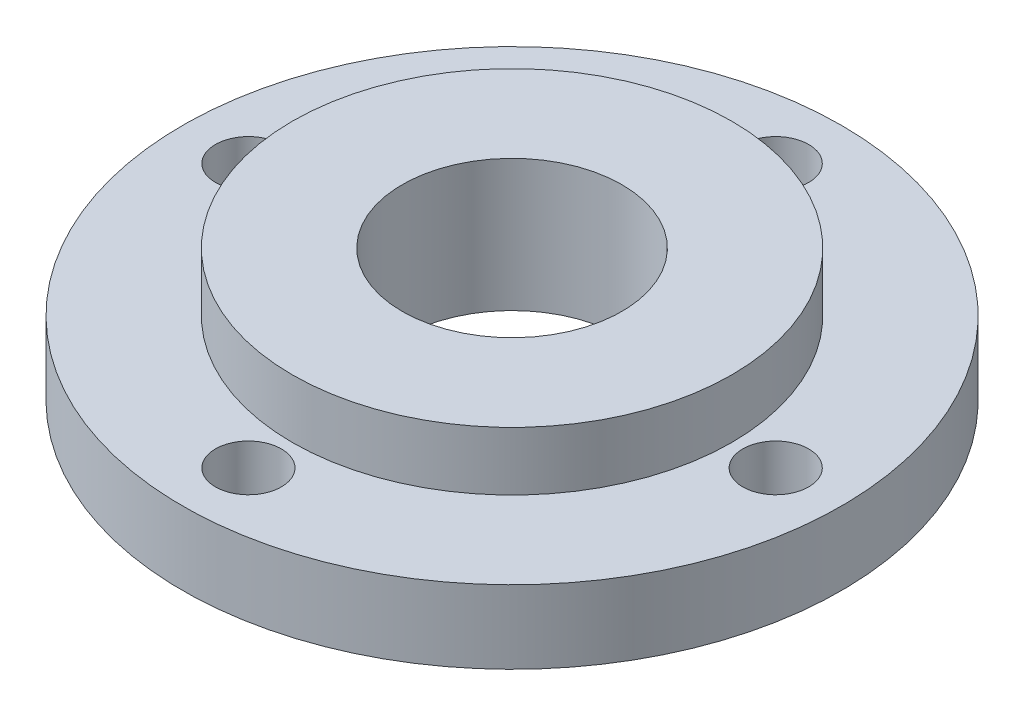
ISO-10303-21;
HEADER;
FILE_DESCRIPTION(('STEP AP214'),'2;1');
FILE_NAME('part.step','',(''),(''),'','','');
FILE_SCHEMA(('AUTOMOTIVE_DESIGN { 1 0 10303 214 1 1 1 1 }'));
ENDSEC;
DATA;
#1=APPLICATION_CONTEXT('core data for automotive mechanical design processes');
#2=APPLICATION_PROTOCOL_DEFINITION('international standard','automotive_design',2000,#1);
#3=PRODUCT_CONTEXT('',#1,'mechanical');
#4=PRODUCT('Part','Part','',(#3));
#5=PRODUCT_RELATED_PRODUCT_CATEGORY('part','',(#4));
#6=PRODUCT_DEFINITION_FORMATION('','',#4);
#7=PRODUCT_DEFINITION_CONTEXT('part definition',#1,'design');
#8=PRODUCT_DEFINITION('design','',#6,#7);
#9=PRODUCT_DEFINITION_SHAPE('','',#8);
#10=(LENGTH_UNIT() NAMED_UNIT(*) SI_UNIT(.MILLI.,.METRE.));
#11=(NAMED_UNIT(*) PLANE_ANGLE_UNIT() SI_UNIT($,.RADIAN.));
#12=(NAMED_UNIT(*) SI_UNIT($,.STERADIAN.) SOLID_ANGLE_UNIT());
#13=UNCERTAINTY_MEASURE_WITH_UNIT(LENGTH_MEASURE(1.E-05),#10,'distance_accuracy_value','');
#14=(GEOMETRIC_REPRESENTATION_CONTEXT(3) GLOBAL_UNCERTAINTY_ASSIGNED_CONTEXT((#13)) GLOBAL_UNIT_ASSIGNED_CONTEXT((#10,
#11,#12)) REPRESENTATION_CONTEXT('',''));
#15=CARTESIAN_POINT('',(0.,0.,0.));
#16=DIRECTION('',(0.,0.,1.));
#17=DIRECTION('',(1.,0.,0.));
#18=AXIS2_PLACEMENT_3D('',#15,#16,#17);
#19=CARTESIAN_POINT('',(0.,-10.,0.));
#20=DIRECTION('',(0.,-1.,0.));
#21=DIRECTION('',(0.,0.,-1.));
#22=AXIS2_PLACEMENT_3D('',#19,#20,#21);
#23=CYLINDRICAL_SURFACE('',#22,15.);
#24=CARTESIAN_POINT('',(0.,0.,0.));
#25=DIRECTION('',(0.,-1.,0.));
#26=DIRECTION('',(0.,0.,-1.));
#27=AXIS2_PLACEMENT_3D('',#24,#25,#26);
#28=CIRCLE('',#27,15.);
#29=CARTESIAN_POINT('',(0.,0.,-15.));
#30=VERTEX_POINT('',#29);
#31=EDGE_CURVE('E10',#30,#30,#28,.T.);
#32=ORIENTED_EDGE('',*,*,#31,.T.);
#33=EDGE_LOOP('',(#32));
#34=FACE_BOUND('',#33,.T.);
#35=CARTESIAN_POINT('',(0.,18.,0.));
#36=DIRECTION('',(0.,-1.,0.));
#37=DIRECTION('',(0.,0.,-1.));
#38=AXIS2_PLACEMENT_3D('',#35,#36,#37);
#39=CIRCLE('',#38,15.);
#40=CARTESIAN_POINT('',(0.,18.,-15.));
#41=VERTEX_POINT('',#40);
#42=EDGE_CURVE('E66',#41,#41,#39,.T.);
#43=ORIENTED_EDGE('',*,*,#42,.F.);
#44=EDGE_LOOP('',(#43));
#45=FACE_BOUND('',#44,.T.);
#46=ADVANCED_FACE('F39',(#34,#45),#23,.F.);
#47=CARTESIAN_POINT('',(15.,0.,0.));
#48=DIRECTION('',(0.,-1.,0.));
#49=DIRECTION('',(0.,0.,-1.));
#50=AXIS2_PLACEMENT_3D('',#47,#48,#49);
#51=PLANE('',#50);
#52=CARTESIAN_POINT('',(36.,0.,0.));
#53=DIRECTION('',(0.,1.,0.));
#54=DIRECTION('',(0.,0.,1.));
#55=AXIS2_PLACEMENT_3D('',#52,#53,#54);
#56=CIRCLE('',#55,4.5);
#57=CARTESIAN_POINT('',(36.,0.,4.5));
#58=VERTEX_POINT('',#57);
#59=EDGE_CURVE('E59',#58,#58,#56,.T.);
#60=ORIENTED_EDGE('',*,*,#59,.T.);
#61=EDGE_LOOP('',(#60));
#62=FACE_BOUND('',#61,.T.);
#63=CARTESIAN_POINT('',(0.,0.,-36.));
#64=DIRECTION('',(0.,1.,0.));
#65=DIRECTION('',(0.,0.,1.));
#66=AXIS2_PLACEMENT_3D('',#63,#64,#65);
#67=CIRCLE('',#66,4.50000000000006);
#68=CARTESIAN_POINT('',(0.,0.,-31.4999999999999));
#69=VERTEX_POINT('',#68);
#70=EDGE_CURVE('E117',#69,#69,#67,.T.);
#71=ORIENTED_EDGE('',*,*,#70,.T.);
#72=EDGE_LOOP('',(#71));
#73=FACE_BOUND('',#72,.T.);
#74=CARTESIAN_POINT('',(-36.,0.,0.));
#75=DIRECTION('',(0.,1.,0.));
#76=DIRECTION('',(0.,0.,1.));
#77=AXIS2_PLACEMENT_3D('',#74,#75,#76);
#78=CIRCLE('',#77,4.5);
#79=CARTESIAN_POINT('',(-36.,0.,4.5));
#80=VERTEX_POINT('',#79);
#81=EDGE_CURVE('E121',#80,#80,#78,.T.);
#82=ORIENTED_EDGE('',*,*,#81,.T.);
#83=EDGE_LOOP('',(#82));
#84=FACE_BOUND('',#83,.T.);
#85=CARTESIAN_POINT('',(0.,0.,36.));
#86=DIRECTION('',(0.,1.,0.));
#87=DIRECTION('',(0.,0.,1.));
#88=AXIS2_PLACEMENT_3D('',#85,#86,#87);
#89=CIRCLE('',#88,4.49999999999983);
#90=CARTESIAN_POINT('',(0.,0.,40.4999999999998));
#91=VERTEX_POINT('',#90);
#92=EDGE_CURVE('E78',#91,#91,#89,.T.);
#93=ORIENTED_EDGE('',*,*,#92,.T.);
#94=EDGE_LOOP('',(#93));
#95=FACE_BOUND('',#94,.T.);
#96=CARTESIAN_POINT('',(0.,0.,0.));
#97=DIRECTION('',(0.,-1.,0.));
#98=DIRECTION('',(0.,0.,-1.));
#99=AXIS2_PLACEMENT_3D('',#96,#97,#98);
#100=CIRCLE('',#99,45.);
#101=CARTESIAN_POINT('',(0.,0.,-45.));
#102=VERTEX_POINT('',#101);
#103=EDGE_CURVE('E46',#102,#102,#100,.T.);
#104=ORIENTED_EDGE('',*,*,#103,.T.);
#105=EDGE_LOOP('',(#104));
#106=FACE_BOUND('',#105,.T.);
#107=ORIENTED_EDGE('',*,*,#31,.F.);
#108=EDGE_LOOP('',(#107));
#109=FACE_BOUND('',#108,.T.);
#110=ADVANCED_FACE('F101',(#62,#73,#84,#95,#106,#109),#51,.T.);
#111=CARTESIAN_POINT('',(0.,-10.,0.));
#112=DIRECTION('',(0.,-1.,0.));
#113=DIRECTION('',(0.,0.,-1.));
#114=AXIS2_PLACEMENT_3D('',#111,#112,#113);
#115=CYLINDRICAL_SURFACE('',#114,45.);
#116=CARTESIAN_POINT('',(0.,10.,0.));
#117=DIRECTION('',(0.,-1.,0.));
#118=DIRECTION('',(0.,0.,-1.));
#119=AXIS2_PLACEMENT_3D('',#116,#117,#118);
#120=CIRCLE('',#119,45.);
#121=CARTESIAN_POINT('',(0.,10.,-45.));
#122=VERTEX_POINT('',#121);
#123=EDGE_CURVE('E51',#122,#122,#120,.T.);
#124=ORIENTED_EDGE('',*,*,#123,.T.);
#125=EDGE_LOOP('',(#124));
#126=FACE_BOUND('',#125,.T.);
#127=ORIENTED_EDGE('',*,*,#103,.F.);
#128=EDGE_LOOP('',(#127));
#129=FACE_BOUND('',#128,.T.);
#130=ADVANCED_FACE('F85',(#126,#129),#115,.T.);
#131=CARTESIAN_POINT('',(45.,10.,0.));
#132=DIRECTION('',(0.,1.,0.));
#133=DIRECTION('',(0.,0.,1.));
#134=AXIS2_PLACEMENT_3D('',#131,#132,#133);
#135=PLANE('',#134);
#136=CARTESIAN_POINT('',(36.,10.,0.));
#137=DIRECTION('',(0.,1.,0.));
#138=DIRECTION('',(0.,0.,1.));
#139=AXIS2_PLACEMENT_3D('',#136,#137,#138);
#140=CIRCLE('',#139,4.5);
#141=CARTESIAN_POINT('',(36.,10.,4.5));
#142=VERTEX_POINT('',#141);
#143=EDGE_CURVE('E42',#142,#142,#140,.F.);
#144=ORIENTED_EDGE('',*,*,#143,.T.);
#145=EDGE_LOOP('',(#144));
#146=FACE_BOUND('',#145,.T.);
#147=CARTESIAN_POINT('',(0.,10.,-36.));
#148=DIRECTION('',(0.,1.,0.));
#149=DIRECTION('',(0.,0.,1.));
#150=AXIS2_PLACEMENT_3D('',#147,#148,#149);
#151=CIRCLE('',#150,4.50000000000006);
#152=CARTESIAN_POINT('',(0.,10.,-31.4999999999999));
#153=VERTEX_POINT('',#152);
#154=EDGE_CURVE('E61',#153,#153,#151,.F.);
#155=ORIENTED_EDGE('',*,*,#154,.T.);
#156=EDGE_LOOP('',(#155));
#157=FACE_BOUND('',#156,.T.);
#158=CARTESIAN_POINT('',(-36.,10.,0.));
#159=DIRECTION('',(0.,1.,0.));
#160=DIRECTION('',(0.,0.,1.));
#161=AXIS2_PLACEMENT_3D('',#158,#159,#160);
#162=CIRCLE('',#161,4.5);
#163=CARTESIAN_POINT('',(-36.,10.,4.5));
#164=VERTEX_POINT('',#163);
#165=EDGE_CURVE('E58',#164,#164,#162,.F.);
#166=ORIENTED_EDGE('',*,*,#165,.T.);
#167=EDGE_LOOP('',(#166));
#168=FACE_BOUND('',#167,.T.);
#169=CARTESIAN_POINT('',(0.,10.,36.));
#170=DIRECTION('',(0.,1.,0.));
#171=DIRECTION('',(0.,0.,1.));
#172=AXIS2_PLACEMENT_3D('',#169,#170,#171);
#173=CIRCLE('',#172,4.49999999999983);
#174=CARTESIAN_POINT('',(0.,10.,40.4999999999998));
#175=VERTEX_POINT('',#174);
#176=EDGE_CURVE('E55',#175,#175,#173,.F.);
#177=ORIENTED_EDGE('',*,*,#176,.T.);
#178=EDGE_LOOP('',(#177));
#179=FACE_BOUND('',#178,.T.);
#180=CARTESIAN_POINT('',(0.,10.,0.));
#181=DIRECTION('',(0.,-1.,0.));
#182=DIRECTION('',(0.,0.,-1.));
#183=AXIS2_PLACEMENT_3D('',#180,#181,#182);
#184=CIRCLE('',#183,30.);
#185=CARTESIAN_POINT('',(0.,10.,-30.));
#186=VERTEX_POINT('',#185);
#187=EDGE_CURVE('E75',#186,#186,#184,.T.);
#188=ORIENTED_EDGE('',*,*,#187,.T.);
#189=EDGE_LOOP('',(#188));
#190=FACE_BOUND('',#189,.T.);
#191=ORIENTED_EDGE('',*,*,#123,.F.);
#192=EDGE_LOOP('',(#191));
#193=FACE_BOUND('',#192,.T.);
#194=ADVANCED_FACE('F88',(#146,#157,#168,#179,#190,#193),#135,.T.);
#195=CARTESIAN_POINT('',(0.,-10.,0.));
#196=DIRECTION('',(0.,-1.,0.));
#197=DIRECTION('',(0.,0.,-1.));
#198=AXIS2_PLACEMENT_3D('',#195,#196,#197);
#199=CYLINDRICAL_SURFACE('',#198,30.);
#200=CARTESIAN_POINT('',(0.,18.,0.));
#201=DIRECTION('',(0.,-1.,0.));
#202=DIRECTION('',(0.,0.,-1.));
#203=AXIS2_PLACEMENT_3D('',#200,#201,#202);
#204=CIRCLE('',#203,30.);
#205=CARTESIAN_POINT('',(0.,18.,-30.));
#206=VERTEX_POINT('',#205);
#207=EDGE_CURVE('E70',#206,#206,#204,.T.);
#208=ORIENTED_EDGE('',*,*,#207,.T.);
#209=EDGE_LOOP('',(#208));
#210=FACE_BOUND('',#209,.T.);
#211=ORIENTED_EDGE('',*,*,#187,.F.);
#212=EDGE_LOOP('',(#211));
#213=FACE_BOUND('',#212,.T.);
#214=ADVANCED_FACE('F90',(#210,#213),#199,.T.);
#215=CARTESIAN_POINT('',(30.,18.,0.));
#216=DIRECTION('',(0.,1.,0.));
#217=DIRECTION('',(0.,0.,1.));
#218=AXIS2_PLACEMENT_3D('',#215,#216,#217);
#219=PLANE('',#218);
#220=ORIENTED_EDGE('',*,*,#42,.T.);
#221=EDGE_LOOP('',(#220));
#222=FACE_BOUND('',#221,.T.);
#223=ORIENTED_EDGE('',*,*,#207,.F.);
#224=EDGE_LOOP('',(#223));
#225=FACE_BOUND('',#224,.T.);
#226=ADVANCED_FACE('F97',(#222,#225),#219,.T.);
#227=CARTESIAN_POINT('',(0.,18.,36.));
#228=DIRECTION('',(0.,-1.,0.));
#229=DIRECTION('',(0.,0.,-1.));
#230=AXIS2_PLACEMENT_3D('',#227,#228,#229);
#231=CYLINDRICAL_SURFACE('',#230,4.49999999999983);
#232=ORIENTED_EDGE('',*,*,#176,.F.);
#233=EDGE_LOOP('',(#232));
#234=FACE_BOUND('',#233,.T.);
#235=ORIENTED_EDGE('',*,*,#92,.F.);
#236=EDGE_LOOP('',(#235));
#237=FACE_BOUND('',#236,.T.);
#238=ADVANCED_FACE('F130',(#234,#237),#231,.F.);
#239=CARTESIAN_POINT('',(-36.,18.,0.));
#240=DIRECTION('',(0.,-1.,0.));
#241=DIRECTION('',(0.,0.,-1.));
#242=AXIS2_PLACEMENT_3D('',#239,#240,#241);
#243=CYLINDRICAL_SURFACE('',#242,4.5);
#244=ORIENTED_EDGE('',*,*,#165,.F.);
#245=EDGE_LOOP('',(#244));
#246=FACE_BOUND('',#245,.T.);
#247=ORIENTED_EDGE('',*,*,#81,.F.);
#248=EDGE_LOOP('',(#247));
#249=FACE_BOUND('',#248,.T.);
#250=ADVANCED_FACE('F131',(#246,#249),#243,.F.);
#251=CARTESIAN_POINT('',(0.,18.,-36.));
#252=DIRECTION('',(0.,-1.,0.));
#253=DIRECTION('',(0.,0.,-1.));
#254=AXIS2_PLACEMENT_3D('',#251,#252,#253);
#255=CYLINDRICAL_SURFACE('',#254,4.50000000000006);
#256=ORIENTED_EDGE('',*,*,#154,.F.);
#257=EDGE_LOOP('',(#256));
#258=FACE_BOUND('',#257,.T.);
#259=ORIENTED_EDGE('',*,*,#70,.F.);
#260=EDGE_LOOP('',(#259));
#261=FACE_BOUND('',#260,.T.);
#262=ADVANCED_FACE('F137',(#258,#261),#255,.F.);
#263=CARTESIAN_POINT('',(36.,18.,0.));
#264=DIRECTION('',(0.,-1.,0.));
#265=DIRECTION('',(0.,0.,-1.));
#266=AXIS2_PLACEMENT_3D('',#263,#264,#265);
#267=CYLINDRICAL_SURFACE('',#266,4.5);
#268=ORIENTED_EDGE('',*,*,#143,.F.);
#269=EDGE_LOOP('',(#268));
#270=FACE_BOUND('',#269,.T.);
#271=ORIENTED_EDGE('',*,*,#59,.F.);
#272=EDGE_LOOP('',(#271));
#273=FACE_BOUND('',#272,.T.);
#274=ADVANCED_FACE('F145',(#270,#273),#267,.F.);
#275=CLOSED_SHELL('',(#46,#110,#130,#194,#214,#226,#238,#250,#262,#274));
#276=MANIFOLD_SOLID_BREP('B2',#275);
#277=ADVANCED_BREP_SHAPE_REPRESENTATION('',(#18,#276),#14);
#278=SHAPE_DEFINITION_REPRESENTATION(#9,#277);
ENDSEC;
END-ISO-10303-21;
